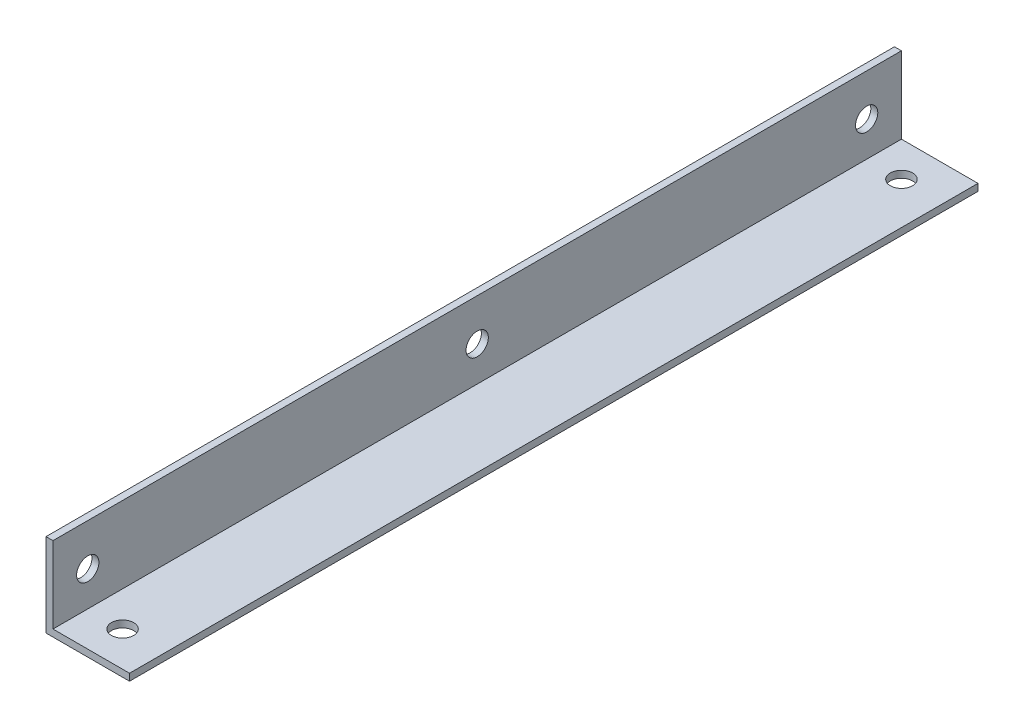
ISO-10303-21;
HEADER;
FILE_DESCRIPTION(('STEP AP214'),'2;1');
FILE_NAME('part.step','',(''),(''),'','','');
FILE_SCHEMA(('AUTOMOTIVE_DESIGN { 1 0 10303 214 1 1 1 1 }'));
ENDSEC;
DATA;
#1=APPLICATION_CONTEXT('core data for automotive mechanical design processes');
#2=APPLICATION_PROTOCOL_DEFINITION('international standard','automotive_design',2000,#1);
#3=PRODUCT_CONTEXT('',#1,'mechanical');
#4=PRODUCT('Part','Part','',(#3));
#5=PRODUCT_RELATED_PRODUCT_CATEGORY('part','',(#4));
#6=PRODUCT_DEFINITION_FORMATION('','',#4);
#7=PRODUCT_DEFINITION_CONTEXT('part definition',#1,'design');
#8=PRODUCT_DEFINITION('design','',#6,#7);
#9=PRODUCT_DEFINITION_SHAPE('','',#8);
#10=(LENGTH_UNIT() NAMED_UNIT(*) SI_UNIT(.MILLI.,.METRE.));
#11=(NAMED_UNIT(*) PLANE_ANGLE_UNIT() SI_UNIT($,.RADIAN.));
#12=(NAMED_UNIT(*) SI_UNIT($,.STERADIAN.) SOLID_ANGLE_UNIT());
#13=UNCERTAINTY_MEASURE_WITH_UNIT(LENGTH_MEASURE(1.E-05),#10,'distance_accuracy_value','');
#14=(GEOMETRIC_REPRESENTATION_CONTEXT(3) GLOBAL_UNCERTAINTY_ASSIGNED_CONTEXT((#13)) GLOBAL_UNIT_ASSIGNED_CONTEXT((#10,
#11,#12)) REPRESENTATION_CONTEXT('',''));
#15=CARTESIAN_POINT('',(0.,0.,0.));
#16=DIRECTION('',(0.,0.,1.));
#17=DIRECTION('',(1.,0.,0.));
#18=AXIS2_PLACEMENT_3D('',#15,#16,#17);
#19=CARTESIAN_POINT('',(30.,0.,304.8));
#20=DIRECTION('',(0.,1.,0.));
#21=DIRECTION('',(-1.,0.,0.));
#22=AXIS2_PLACEMENT_3D('',#19,#20,#21);
#23=PLANE('',#22);
#24=CARTESIAN_POINT('',(15.,0.,292.3));
#25=DIRECTION('',(0.,1.,0.));
#26=DIRECTION('',(1.,0.,0.));
#27=AXIS2_PLACEMENT_3D('',#24,#25,#26);
#28=CIRCLE('',#27,4.);
#29=CARTESIAN_POINT('',(19.,0.,292.3));
#30=VERTEX_POINT('',#29);
#31=EDGE_CURVE('E163',#30,#30,#28,.T.);
#32=ORIENTED_EDGE('',*,*,#31,.T.);
#33=EDGE_LOOP('',(#32));
#34=FACE_BOUND('',#33,.T.);
#35=CARTESIAN_POINT('',(15.,0.,12.5));
#36=DIRECTION('',(0.,1.,0.));
#37=DIRECTION('',(-1.,0.,0.));
#38=AXIS2_PLACEMENT_3D('',#35,#36,#37);
#39=CIRCLE('',#38,4.);
#40=CARTESIAN_POINT('',(11.,0.,12.5));
#41=VERTEX_POINT('',#40);
#42=EDGE_CURVE('E121',#41,#41,#39,.T.);
#43=ORIENTED_EDGE('',*,*,#42,.T.);
#44=EDGE_LOOP('',(#43));
#45=FACE_BOUND('',#44,.T.);
#46=DIRECTION('',(1.,0.,0.));
#47=VECTOR('',#46,1.);
#48=CARTESIAN_POINT('',(30.,0.,0.));
#49=LINE('',#48,#47);
#50=CARTESIAN_POINT('',(0.,0.,0.));
#51=VERTEX_POINT('',#50);
#52=CARTESIAN_POINT('',(30.,0.,0.));
#53=VERTEX_POINT('',#52);
#54=EDGE_CURVE('E117',#51,#53,#49,.T.);
#55=ORIENTED_EDGE('',*,*,#54,.T.);
#56=DIRECTION('',(0.,0.,-1.));
#57=VECTOR('',#56,1.);
#58=CARTESIAN_POINT('',(30.,0.,304.8));
#59=LINE('',#58,#57);
#60=CARTESIAN_POINT('',(30.,0.,304.8));
#61=VERTEX_POINT('',#60);
#62=EDGE_CURVE('E11',#61,#53,#59,.T.);
#63=ORIENTED_EDGE('',*,*,#62,.F.);
#64=DIRECTION('',(1.,0.,0.));
#65=VECTOR('',#64,1.);
#66=CARTESIAN_POINT('',(30.,0.,304.8));
#67=LINE('',#66,#65);
#68=CARTESIAN_POINT('',(0.,0.,304.8));
#69=VERTEX_POINT('',#68);
#70=EDGE_CURVE('E128',#69,#61,#67,.T.);
#71=ORIENTED_EDGE('',*,*,#70,.F.);
#72=DIRECTION('',(0.,0.,-1.));
#73=VECTOR('',#72,1.);
#74=CARTESIAN_POINT('',(0.,0.,304.8));
#75=LINE('',#74,#73);
#76=EDGE_CURVE('E113',#69,#51,#75,.T.);
#77=ORIENTED_EDGE('',*,*,#76,.T.);
#78=EDGE_LOOP('',(#55,#63,#71,#77));
#79=FACE_BOUND('',#78,.T.);
#80=ADVANCED_FACE('F33',(#34,#45,#79),#23,.F.);
#81=CARTESIAN_POINT('',(30.,2.5,304.8));
#82=DIRECTION('',(-1.,0.,0.));
#83=DIRECTION('',(0.,0.,1.));
#84=AXIS2_PLACEMENT_3D('',#81,#82,#83);
#85=PLANE('',#84);
#86=DIRECTION('',(0.,1.,0.));
#87=VECTOR('',#86,1.);
#88=CARTESIAN_POINT('',(30.,2.5,0.));
#89=LINE('',#88,#87);
#90=CARTESIAN_POINT('',(30.,2.5,0.));
#91=VERTEX_POINT('',#90);
#92=EDGE_CURVE('E120',#53,#91,#89,.T.);
#93=ORIENTED_EDGE('',*,*,#92,.T.);
#94=DIRECTION('',(0.,0.,-1.));
#95=VECTOR('',#94,1.);
#96=CARTESIAN_POINT('',(30.,2.5,304.8));
#97=LINE('',#96,#95);
#98=CARTESIAN_POINT('',(30.,2.5,304.8));
#99=VERTEX_POINT('',#98);
#100=EDGE_CURVE('E41',#99,#91,#97,.T.);
#101=ORIENTED_EDGE('',*,*,#100,.F.);
#102=DIRECTION('',(0.,1.,0.));
#103=VECTOR('',#102,1.);
#104=CARTESIAN_POINT('',(30.,2.5,304.8));
#105=LINE('',#104,#103);
#106=EDGE_CURVE('E86',#61,#99,#105,.T.);
#107=ORIENTED_EDGE('',*,*,#106,.F.);
#108=ORIENTED_EDGE('',*,*,#62,.T.);
#109=EDGE_LOOP('',(#93,#101,#107,#108));
#110=FACE_BOUND('',#109,.T.);
#111=ADVANCED_FACE('F155',(#110),#85,.F.);
#112=CARTESIAN_POINT('',(2.5,2.5,304.8));
#113=DIRECTION('',(0.,-1.,0.));
#114=DIRECTION('',(1.,0.,0.));
#115=AXIS2_PLACEMENT_3D('',#112,#113,#114);
#116=PLANE('',#115);
#117=CARTESIAN_POINT('',(15.,2.5,292.3));
#118=DIRECTION('',(0.,1.,0.));
#119=DIRECTION('',(1.,0.,0.));
#120=AXIS2_PLACEMENT_3D('',#117,#118,#119);
#121=CIRCLE('',#120,4.);
#122=CARTESIAN_POINT('',(19.,2.5,292.3));
#123=VERTEX_POINT('',#122);
#124=EDGE_CURVE('E172',#123,#123,#121,.T.);
#125=ORIENTED_EDGE('',*,*,#124,.F.);
#126=EDGE_LOOP('',(#125));
#127=FACE_BOUND('',#126,.T.);
#128=CARTESIAN_POINT('',(15.,2.5,12.5));
#129=DIRECTION('',(0.,1.,0.));
#130=DIRECTION('',(-1.,0.,0.));
#131=AXIS2_PLACEMENT_3D('',#128,#129,#130);
#132=CIRCLE('',#131,4.);
#133=CARTESIAN_POINT('',(11.,2.5,12.5));
#134=VERTEX_POINT('',#133);
#135=EDGE_CURVE('E167',#134,#134,#132,.T.);
#136=ORIENTED_EDGE('',*,*,#135,.F.);
#137=EDGE_LOOP('',(#136));
#138=FACE_BOUND('',#137,.T.);
#139=DIRECTION('',(-1.,0.,0.));
#140=VECTOR('',#139,1.);
#141=CARTESIAN_POINT('',(2.5,2.5,0.));
#142=LINE('',#141,#140);
#143=CARTESIAN_POINT('',(2.5,2.5,0.));
#144=VERTEX_POINT('',#143);
#145=EDGE_CURVE('E123',#91,#144,#142,.T.);
#146=ORIENTED_EDGE('',*,*,#145,.T.);
#147=DIRECTION('',(0.,0.,-1.));
#148=VECTOR('',#147,1.);
#149=CARTESIAN_POINT('',(2.5,2.5,304.8));
#150=LINE('',#149,#148);
#151=CARTESIAN_POINT('',(2.5,2.5,304.8));
#152=VERTEX_POINT('',#151);
#153=EDGE_CURVE('E108',#152,#144,#150,.T.);
#154=ORIENTED_EDGE('',*,*,#153,.F.);
#155=DIRECTION('',(-1.,0.,0.));
#156=VECTOR('',#155,1.);
#157=CARTESIAN_POINT('',(2.5,2.5,304.8));
#158=LINE('',#157,#156);
#159=EDGE_CURVE('E99',#99,#152,#158,.T.);
#160=ORIENTED_EDGE('',*,*,#159,.F.);
#161=ORIENTED_EDGE('',*,*,#100,.T.);
#162=EDGE_LOOP('',(#146,#154,#160,#161));
#163=FACE_BOUND('',#162,.T.);
#164=ADVANCED_FACE('F134',(#127,#138,#163),#116,.F.);
#165=CARTESIAN_POINT('',(2.5,30.,304.8));
#166=DIRECTION('',(-1.,0.,0.));
#167=DIRECTION('',(0.,-1.,0.));
#168=AXIS2_PLACEMENT_3D('',#165,#166,#167);
#169=PLANE('',#168);
#170=CARTESIAN_POINT('',(2.5,15.,152.4));
#171=DIRECTION('',(1.,0.,0.));
#172=DIRECTION('',(0.,1.,0.));
#173=AXIS2_PLACEMENT_3D('',#170,#171,#172);
#174=CIRCLE('',#173,3.99999999999999);
#175=CARTESIAN_POINT('',(2.5,19.,152.4));
#176=VERTEX_POINT('',#175);
#177=EDGE_CURVE('E191',#176,#176,#174,.T.);
#178=ORIENTED_EDGE('',*,*,#177,.F.);
#179=EDGE_LOOP('',(#178));
#180=FACE_BOUND('',#179,.T.);
#181=CARTESIAN_POINT('',(2.5,15.,292.3));
#182=DIRECTION('',(1.,0.,0.));
#183=DIRECTION('',(0.,-1.,0.));
#184=AXIS2_PLACEMENT_3D('',#181,#182,#183);
#185=CIRCLE('',#184,4.00000000000005);
#186=CARTESIAN_POINT('',(2.5,10.9999999999999,292.3));
#187=VERTEX_POINT('',#186);
#188=EDGE_CURVE('E185',#187,#187,#185,.T.);
#189=ORIENTED_EDGE('',*,*,#188,.F.);
#190=EDGE_LOOP('',(#189));
#191=FACE_BOUND('',#190,.T.);
#192=CARTESIAN_POINT('',(2.5,15.,12.5));
#193=DIRECTION('',(1.,0.,0.));
#194=DIRECTION('',(0.,1.,0.));
#195=AXIS2_PLACEMENT_3D('',#192,#193,#194);
#196=CIRCLE('',#195,4.);
#197=CARTESIAN_POINT('',(2.5,19.,12.5));
#198=VERTEX_POINT('',#197);
#199=EDGE_CURVE('E179',#198,#198,#196,.T.);
#200=ORIENTED_EDGE('',*,*,#199,.F.);
#201=EDGE_LOOP('',(#200));
#202=FACE_BOUND('',#201,.T.);
#203=DIRECTION('',(0.,1.,0.));
#204=VECTOR('',#203,1.);
#205=CARTESIAN_POINT('',(2.5,30.,0.));
#206=LINE('',#205,#204);
#207=CARTESIAN_POINT('',(2.5,30.,0.));
#208=VERTEX_POINT('',#207);
#209=EDGE_CURVE('E107',#144,#208,#206,.T.);
#210=ORIENTED_EDGE('',*,*,#209,.T.);
#211=DIRECTION('',(0.,0.,-1.));
#212=VECTOR('',#211,1.);
#213=CARTESIAN_POINT('',(2.5,30.,304.8));
#214=LINE('',#213,#212);
#215=CARTESIAN_POINT('',(2.5,30.,304.8));
#216=VERTEX_POINT('',#215);
#217=EDGE_CURVE('E104',#216,#208,#214,.T.);
#218=ORIENTED_EDGE('',*,*,#217,.F.);
#219=DIRECTION('',(0.,1.,0.));
#220=VECTOR('',#219,1.);
#221=CARTESIAN_POINT('',(2.5,30.,304.8));
#222=LINE('',#221,#220);
#223=EDGE_CURVE('E93',#152,#216,#222,.T.);
#224=ORIENTED_EDGE('',*,*,#223,.F.);
#225=ORIENTED_EDGE('',*,*,#153,.T.);
#226=EDGE_LOOP('',(#210,#218,#224,#225));
#227=FACE_BOUND('',#226,.T.);
#228=ADVANCED_FACE('F105',(#180,#191,#202,#227),#169,.F.);
#229=CARTESIAN_POINT('',(0.,30.,304.8));
#230=DIRECTION('',(0.,-1.,0.));
#231=DIRECTION('',(0.,0.,-1.));
#232=AXIS2_PLACEMENT_3D('',#229,#230,#231);
#233=PLANE('',#232);
#234=DIRECTION('',(-1.,0.,0.));
#235=VECTOR('',#234,1.);
#236=CARTESIAN_POINT('',(0.,30.,0.));
#237=LINE('',#236,#235);
#238=CARTESIAN_POINT('',(0.,30.,0.));
#239=VERTEX_POINT('',#238);
#240=EDGE_CURVE('E72',#208,#239,#237,.T.);
#241=ORIENTED_EDGE('',*,*,#240,.T.);
#242=DIRECTION('',(0.,0.,-1.));
#243=VECTOR('',#242,1.);
#244=CARTESIAN_POINT('',(0.,30.,304.8));
#245=LINE('',#244,#243);
#246=CARTESIAN_POINT('',(0.,30.,304.8));
#247=VERTEX_POINT('',#246);
#248=EDGE_CURVE('E109',#247,#239,#245,.T.);
#249=ORIENTED_EDGE('',*,*,#248,.F.);
#250=DIRECTION('',(-1.,0.,0.));
#251=VECTOR('',#250,1.);
#252=CARTESIAN_POINT('',(0.,30.,304.8));
#253=LINE('',#252,#251);
#254=EDGE_CURVE('E97',#216,#247,#253,.T.);
#255=ORIENTED_EDGE('',*,*,#254,.F.);
#256=ORIENTED_EDGE('',*,*,#217,.T.);
#257=EDGE_LOOP('',(#241,#249,#255,#256));
#258=FACE_BOUND('',#257,.T.);
#259=ADVANCED_FACE('F111',(#258),#233,.F.);
#260=CARTESIAN_POINT('',(0.,0.,304.8));
#261=DIRECTION('',(1.,0.,0.));
#262=DIRECTION('',(0.,0.,-1.));
#263=AXIS2_PLACEMENT_3D('',#260,#261,#262);
#264=PLANE('',#263);
#265=CARTESIAN_POINT('',(0.,15.,152.4));
#266=DIRECTION('',(1.,0.,0.));
#267=DIRECTION('',(0.,1.,0.));
#268=AXIS2_PLACEMENT_3D('',#265,#266,#267);
#269=CIRCLE('',#268,3.99999999999999);
#270=CARTESIAN_POINT('',(0.,19.,152.4));
#271=VERTEX_POINT('',#270);
#272=EDGE_CURVE('E188',#271,#271,#269,.T.);
#273=ORIENTED_EDGE('',*,*,#272,.T.);
#274=EDGE_LOOP('',(#273));
#275=FACE_BOUND('',#274,.T.);
#276=CARTESIAN_POINT('',(0.,15.,292.3));
#277=DIRECTION('',(1.,0.,0.));
#278=DIRECTION('',(0.,-1.,0.));
#279=AXIS2_PLACEMENT_3D('',#276,#277,#278);
#280=CIRCLE('',#279,4.00000000000005);
#281=CARTESIAN_POINT('',(0.,10.9999999999999,292.3));
#282=VERTEX_POINT('',#281);
#283=EDGE_CURVE('E182',#282,#282,#280,.T.);
#284=ORIENTED_EDGE('',*,*,#283,.T.);
#285=EDGE_LOOP('',(#284));
#286=FACE_BOUND('',#285,.T.);
#287=CARTESIAN_POINT('',(0.,15.,12.5));
#288=DIRECTION('',(1.,0.,0.));
#289=DIRECTION('',(0.,1.,0.));
#290=AXIS2_PLACEMENT_3D('',#287,#288,#289);
#291=CIRCLE('',#290,4.);
#292=CARTESIAN_POINT('',(0.,19.,12.5));
#293=VERTEX_POINT('',#292);
#294=EDGE_CURVE('E177',#293,#293,#291,.T.);
#295=ORIENTED_EDGE('',*,*,#294,.T.);
#296=EDGE_LOOP('',(#295));
#297=FACE_BOUND('',#296,.T.);
#298=DIRECTION('',(0.,-1.,0.));
#299=VECTOR('',#298,1.);
#300=CARTESIAN_POINT('',(0.,0.,0.));
#301=LINE('',#300,#299);
#302=EDGE_CURVE('E78',#239,#51,#301,.T.);
#303=ORIENTED_EDGE('',*,*,#302,.T.);
#304=ORIENTED_EDGE('',*,*,#76,.F.);
#305=DIRECTION('',(0.,-1.,0.));
#306=VECTOR('',#305,1.);
#307=CARTESIAN_POINT('',(0.,0.,304.8));
#308=LINE('',#307,#306);
#309=EDGE_CURVE('E49',#247,#69,#308,.T.);
#310=ORIENTED_EDGE('',*,*,#309,.F.);
#311=ORIENTED_EDGE('',*,*,#248,.T.);
#312=EDGE_LOOP('',(#303,#304,#310,#311));
#313=FACE_BOUND('',#312,.T.);
#314=ADVANCED_FACE('F141',(#275,#286,#297,#313),#264,.F.);
#315=CARTESIAN_POINT('',(0.,0.,304.8));
#316=DIRECTION('',(0.,0.,-1.));
#317=DIRECTION('',(-1.,0.,0.));
#318=AXIS2_PLACEMENT_3D('',#315,#316,#317);
#319=PLANE('',#318);
#320=ORIENTED_EDGE('',*,*,#70,.T.);
#321=ORIENTED_EDGE('',*,*,#106,.T.);
#322=ORIENTED_EDGE('',*,*,#159,.T.);
#323=ORIENTED_EDGE('',*,*,#223,.T.);
#324=ORIENTED_EDGE('',*,*,#254,.T.);
#325=ORIENTED_EDGE('',*,*,#309,.T.);
#326=EDGE_LOOP('',(#320,#321,#322,#323,#324,#325));
#327=FACE_BOUND('',#326,.T.);
#328=ADVANCED_FACE('F95',(#327),#319,.F.);
#329=CARTESIAN_POINT('',(0.,0.,0.));
#330=DIRECTION('',(0.,0.,-1.));
#331=DIRECTION('',(-1.,0.,0.));
#332=AXIS2_PLACEMENT_3D('',#329,#330,#331);
#333=PLANE('',#332);
#334=ORIENTED_EDGE('',*,*,#54,.F.);
#335=ORIENTED_EDGE('',*,*,#302,.F.);
#336=ORIENTED_EDGE('',*,*,#240,.F.);
#337=ORIENTED_EDGE('',*,*,#209,.F.);
#338=ORIENTED_EDGE('',*,*,#145,.F.);
#339=ORIENTED_EDGE('',*,*,#92,.F.);
#340=EDGE_LOOP('',(#334,#335,#336,#337,#338,#339));
#341=FACE_BOUND('',#340,.T.);
#342=ADVANCED_FACE('F137',(#341),#333,.T.);
#343=CARTESIAN_POINT('',(15.,0.,12.5));
#344=DIRECTION('',(0.,1.,0.));
#345=DIRECTION('',(-1.,0.,0.));
#346=AXIS2_PLACEMENT_3D('',#343,#344,#345);
#347=CYLINDRICAL_SURFACE('',#346,4.);
#348=ORIENTED_EDGE('',*,*,#42,.F.);
#349=EDGE_LOOP('',(#348));
#350=FACE_BOUND('',#349,.T.);
#351=ORIENTED_EDGE('',*,*,#135,.T.);
#352=EDGE_LOOP('',(#351));
#353=FACE_BOUND('',#352,.T.);
#354=ADVANCED_FACE('F221',(#350,#353),#347,.F.);
#355=CARTESIAN_POINT('',(15.,0.,292.3));
#356=DIRECTION('',(0.,1.,0.));
#357=DIRECTION('',(-1.,0.,0.));
#358=AXIS2_PLACEMENT_3D('',#355,#356,#357);
#359=CYLINDRICAL_SURFACE('',#358,4.);
#360=ORIENTED_EDGE('',*,*,#31,.F.);
#361=EDGE_LOOP('',(#360));
#362=FACE_BOUND('',#361,.T.);
#363=ORIENTED_EDGE('',*,*,#124,.T.);
#364=EDGE_LOOP('',(#363));
#365=FACE_BOUND('',#364,.T.);
#366=ADVANCED_FACE('F212',(#362,#365),#359,.F.);
#367=CARTESIAN_POINT('',(0.,15.,12.5));
#368=DIRECTION('',(1.,0.,0.));
#369=DIRECTION('',(0.,1.,0.));
#370=AXIS2_PLACEMENT_3D('',#367,#368,#369);
#371=CYLINDRICAL_SURFACE('',#370,4.);
#372=ORIENTED_EDGE('',*,*,#294,.F.);
#373=EDGE_LOOP('',(#372));
#374=FACE_BOUND('',#373,.T.);
#375=ORIENTED_EDGE('',*,*,#199,.T.);
#376=EDGE_LOOP('',(#375));
#377=FACE_BOUND('',#376,.T.);
#378=ADVANCED_FACE('F210',(#374,#377),#371,.F.);
#379=CARTESIAN_POINT('',(0.,15.,292.3));
#380=DIRECTION('',(1.,0.,0.));
#381=DIRECTION('',(0.,1.,0.));
#382=AXIS2_PLACEMENT_3D('',#379,#380,#381);
#383=CYLINDRICAL_SURFACE('',#382,4.00000000000005);
#384=ORIENTED_EDGE('',*,*,#283,.F.);
#385=EDGE_LOOP('',(#384));
#386=FACE_BOUND('',#385,.T.);
#387=ORIENTED_EDGE('',*,*,#188,.T.);
#388=EDGE_LOOP('',(#387));
#389=FACE_BOUND('',#388,.T.);
#390=ADVANCED_FACE('F199',(#386,#389),#383,.F.);
#391=CARTESIAN_POINT('',(0.,15.,152.4));
#392=DIRECTION('',(1.,0.,0.));
#393=DIRECTION('',(0.,1.,0.));
#394=AXIS2_PLACEMENT_3D('',#391,#392,#393);
#395=CYLINDRICAL_SURFACE('',#394,3.99999999999999);
#396=CARTESIAN_POINT('',(0.,19.,152.4));
#397=CARTESIAN_POINT('',(0.02604166666666,19.,152.4));
#398=CARTESIAN_POINT('',(0.0520833333333268,19.,152.4));
#399=CARTESIAN_POINT('',(0.10416666666666,19.,152.4));
#400=CARTESIAN_POINT('',(0.130208333333327,19.,152.4));
#401=CARTESIAN_POINT('',(0.182291666666661,19.,152.4));
#402=CARTESIAN_POINT('',(0.208333333333327,19.,152.4));
#403=CARTESIAN_POINT('',(0.260416666666661,19.,152.4));
#404=CARTESIAN_POINT('',(0.286458333333328,19.,152.4));
#405=CARTESIAN_POINT('',(0.338541666666661,19.,152.4));
#406=CARTESIAN_POINT('',(0.364583333333328,19.,152.4));
#407=CARTESIAN_POINT('',(0.416666666666661,19.,152.4));
#408=CARTESIAN_POINT('',(0.442708333333328,19.,152.4));
#409=CARTESIAN_POINT('',(0.494791666666662,19.,152.4));
#410=CARTESIAN_POINT('',(0.520833333333328,19.,152.4));
#411=CARTESIAN_POINT('',(0.572916666666662,19.,152.4));
#412=CARTESIAN_POINT('',(0.598958333333329,19.,152.4));
#413=CARTESIAN_POINT('',(0.651041666666662,19.,152.4));
#414=CARTESIAN_POINT('',(0.677083333333329,19.,152.4));
#415=CARTESIAN_POINT('',(0.729166666666663,19.,152.4));
#416=CARTESIAN_POINT('',(0.755208333333329,19.,152.4));
#417=CARTESIAN_POINT('',(0.807291666666663,19.,152.4));
#418=CARTESIAN_POINT('',(0.83333333333333,19.,152.4));
#419=CARTESIAN_POINT('',(0.885416666666663,19.,152.4));
#420=CARTESIAN_POINT('',(0.91145833333333,19.,152.4));
#421=CARTESIAN_POINT('',(0.963541666666663,19.,152.4));
#422=CARTESIAN_POINT('',(0.98958333333333,19.,152.4));
#423=CARTESIAN_POINT('',(1.04166666666666,19.,152.4));
#424=CARTESIAN_POINT('',(1.06770833333333,19.,152.4));
#425=CARTESIAN_POINT('',(1.11979166666666,19.,152.4));
#426=CARTESIAN_POINT('',(1.14583333333333,19.,152.4));
#427=CARTESIAN_POINT('',(1.19791666666666,19.,152.4));
#428=CARTESIAN_POINT('',(1.22395833333333,19.,152.4));
#429=CARTESIAN_POINT('',(1.27604166666666,19.,152.4));
#430=CARTESIAN_POINT('',(1.30208333333333,19.,152.4));
#431=CARTESIAN_POINT('',(1.35416666666666,19.,152.4));
#432=CARTESIAN_POINT('',(1.38020833333333,19.,152.4));
#433=CARTESIAN_POINT('',(1.43229166666666,19.,152.4));
#434=CARTESIAN_POINT('',(1.45833333333333,19.,152.4));
#435=CARTESIAN_POINT('',(1.51041666666667,19.,152.4));
#436=CARTESIAN_POINT('',(1.53645833333333,19.,152.4));
#437=CARTESIAN_POINT('',(1.58854166666667,19.,152.4));
#438=CARTESIAN_POINT('',(1.61458333333333,19.,152.4));
#439=CARTESIAN_POINT('',(1.66666666666667,19.,152.4));
#440=CARTESIAN_POINT('',(1.69270833333333,19.,152.4));
#441=CARTESIAN_POINT('',(1.74479166666667,19.,152.4));
#442=CARTESIAN_POINT('',(1.77083333333333,19.,152.4));
#443=CARTESIAN_POINT('',(1.82291666666667,19.,152.4));
#444=CARTESIAN_POINT('',(1.84895833333333,19.,152.4));
#445=CARTESIAN_POINT('',(1.90104166666667,19.,152.4));
#446=CARTESIAN_POINT('',(1.92708333333333,19.,152.4));
#447=CARTESIAN_POINT('',(1.97916666666667,19.,152.4));
#448=CARTESIAN_POINT('',(2.00520833333333,19.,152.4));
#449=CARTESIAN_POINT('',(2.05729166666667,19.,152.4));
#450=CARTESIAN_POINT('',(2.08333333333333,19.,152.4));
#451=CARTESIAN_POINT('',(2.13541666666667,19.,152.4));
#452=CARTESIAN_POINT('',(2.16145833333333,19.,152.4));
#453=CARTESIAN_POINT('',(2.21354166666667,19.,152.4));
#454=CARTESIAN_POINT('',(2.23958333333333,19.,152.4));
#455=CARTESIAN_POINT('',(2.29166666666667,19.,152.4));
#456=CARTESIAN_POINT('',(2.31770833333333,19.,152.4));
#457=CARTESIAN_POINT('',(2.36979166666667,19.,152.4));
#458=CARTESIAN_POINT('',(2.39583333333333,19.,152.4));
#459=CARTESIAN_POINT('',(2.44791666666667,19.,152.4));
#460=CARTESIAN_POINT('',(2.47395833333333,19.,152.4));
#461=CARTESIAN_POINT('',(2.5,19.,152.4));
#462=B_SPLINE_CURVE_WITH_KNOTS('',3,(#396,#397,#398,#399,#400,#401,#402,#403,#404,#405,#406,
#407,#408,#409,#410,#411,#412,#413,#414,#415,#416,#417,#418,#419,#420,#421,#422,#423,#424,#425,
#426,#427,#428,#429,#430,#431,#432,#433,#434,#435,#436,#437,#438,#439,#440,#441,#442,#443,#444,
#445,#446,#447,#448,#449,#450,#451,#452,#453,#454,#455,#456,#457,#458,#459,#460,#461),
.UNSPECIFIED.,.F.,.F.,(4,2,2,2,2,2,2,2,2,2,2,2,2,2,2,2,2,2,2,2,2,2,2,2,2,2,2,2,2,2,2,2,4),(0.,
0.0781250000000003,0.156250000000001,0.234375000000001,0.312500000000001,0.390625000000001,
0.468750000000002,0.546875000000002,0.625000000000002,0.703125000000002,0.781250000000003,
0.859375000000003,0.937500000000003,1.015625,1.09375,1.171875,1.25,1.328125,1.40625,
1.48437500000001,1.56250000000001,1.64062500000001,1.71875000000001,1.79687500000001,
1.87500000000001,1.95312500000001,2.03125000000001,2.10937500000001,2.18750000000001,
2.26562500000001,2.34375000000001,2.42187500000001,2.50000000000001),.UNSPECIFIED.);
#463=EDGE_CURVE('BSEAM196',#271,#176,#462,.T.);
#464=ORIENTED_EDGE('',*,*,#272,.F.);
#465=ORIENTED_EDGE('',*,*,#177,.T.);
#466=ORIENTED_EDGE('',*,*,#463,.T.);
#467=ORIENTED_EDGE('',*,*,#463,.F.);
#468=EDGE_LOOP('',(#464,#466,#465,#467));
#469=FACE_BOUND('',#468,.T.);
#470=ADVANCED_FACE('F196',(#469),#395,.F.);
#471=CLOSED_SHELL('',(#80,#111,#164,#228,#259,#314,#328,#342,#354,#366,#378,#390,#470));
#472=MANIFOLD_SOLID_BREP('B2',#471);
#473=ADVANCED_BREP_SHAPE_REPRESENTATION('',(#18,#472),#14);
#474=SHAPE_DEFINITION_REPRESENTATION(#9,#473);
ENDSEC;
END-ISO-10303-21;
